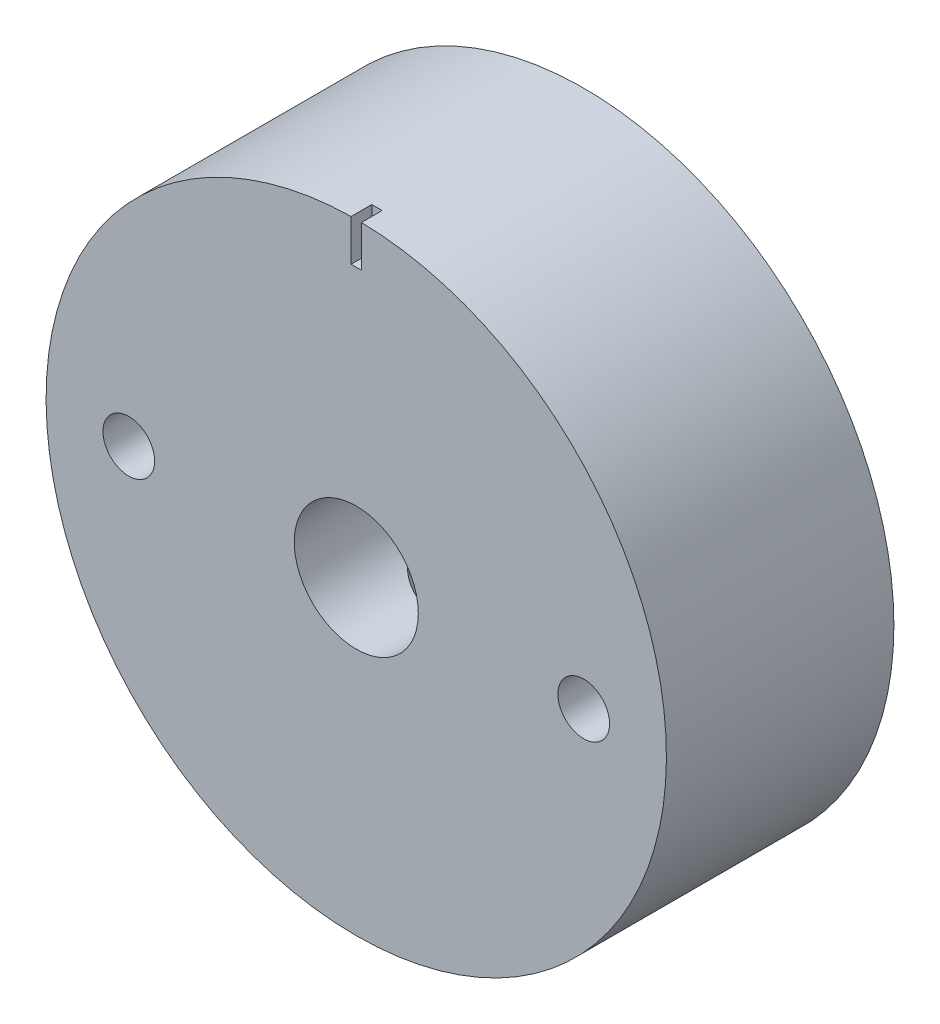
ISO-10303-21;
HEADER;
FILE_DESCRIPTION(('STEP AP214'),'2;1');
FILE_NAME('part.step','',(''),(''),'','','');
FILE_SCHEMA(('AUTOMOTIVE_DESIGN { 1 0 10303 214 1 1 1 1 }'));
ENDSEC;
DATA;
#1=APPLICATION_CONTEXT('core data for automotive mechanical design processes');
#2=APPLICATION_PROTOCOL_DEFINITION('international standard','automotive_design',2000,#1);
#3=PRODUCT_CONTEXT('',#1,'mechanical');
#4=PRODUCT('Part','Part','',(#3));
#5=PRODUCT_RELATED_PRODUCT_CATEGORY('part','',(#4));
#6=PRODUCT_DEFINITION_FORMATION('','',#4);
#7=PRODUCT_DEFINITION_CONTEXT('part definition',#1,'design');
#8=PRODUCT_DEFINITION('design','',#6,#7);
#9=PRODUCT_DEFINITION_SHAPE('','',#8);
#10=(LENGTH_UNIT() NAMED_UNIT(*) SI_UNIT(.MILLI.,.METRE.));
#11=(NAMED_UNIT(*) PLANE_ANGLE_UNIT() SI_UNIT($,.RADIAN.));
#12=(NAMED_UNIT(*) SI_UNIT($,.STERADIAN.) SOLID_ANGLE_UNIT());
#13=UNCERTAINTY_MEASURE_WITH_UNIT(LENGTH_MEASURE(1.E-05),#10,'distance_accuracy_value','');
#14=(GEOMETRIC_REPRESENTATION_CONTEXT(3) GLOBAL_UNCERTAINTY_ASSIGNED_CONTEXT((#13)) GLOBAL_UNIT_ASSIGNED_CONTEXT((#10,
#11,#12)) REPRESENTATION_CONTEXT('',''));
#15=CARTESIAN_POINT('',(0.,0.,0.));
#16=DIRECTION('',(0.,0.,1.));
#17=DIRECTION('',(1.,0.,0.));
#18=AXIS2_PLACEMENT_3D('',#15,#16,#17);
#19=CARTESIAN_POINT('',(0.,0.,11.));
#20=DIRECTION('',(0.,0.,-1.));
#21=DIRECTION('',(-1.,0.,0.));
#22=AXIS2_PLACEMENT_3D('',#19,#20,#21);
#23=CYLINDRICAL_SURFACE('',#22,15.);
#24=CARTESIAN_POINT('',(0.,-15.,7.5));
#25=CARTESIAN_POINT('',(0.139390904958215,-14.9999976116882,7.49999441105218));
#26=CARTESIAN_POINT('',(0.278857881838821,-14.9980367791303,7.48830272503108));
#27=CARTESIAN_POINT('',(0.553880221673043,-14.9904034494139,7.44186434123468));
#28=CARTESIAN_POINT('',(0.689431867959247,-14.9847275392389,7.4070964430884));
#29=CARTESIAN_POINT('',(0.952604747212644,-14.9703006823645,7.31558455140725));
#30=CARTESIAN_POINT('',(1.0802323684319,-14.9615522515919,7.25885853435943));
#31=CARTESIAN_POINT('',(1.32414184197795,-14.9419422708207,7.1250877079476));
#32=CARTESIAN_POINT('',(1.44042498987859,-14.9310809625443,7.048045222517));
#33=CARTESIAN_POINT('',(1.65947261429168,-14.9083331745831,6.87504491617954));
#34=CARTESIAN_POINT('',(1.76211290353497,-14.8964387181486,6.77893088536387));
#35=CARTESIAN_POINT('',(1.94988849865993,-14.8730262687673,6.57085203152719));
#36=CARTESIAN_POINT('',(2.03502269939097,-14.8615082996267,6.45888620854339));
#37=CARTESIAN_POINT('',(2.18586712560513,-14.8400756575978,6.22142903380294));
#38=CARTESIAN_POINT('',(2.251454552861,-14.8301712909164,6.09585866319524));
#39=CARTESIAN_POINT('',(2.36055836541122,-14.8131978979467,5.83529043569937));
#40=CARTESIAN_POINT('',(2.40407624156561,-14.8061286801431,5.70029321632237));
#41=CARTESIAN_POINT('',(2.46741437778481,-14.7957053684276,5.42601972514346));
#42=CARTESIAN_POINT('',(2.4874490291354,-14.792317684857,5.28679426349861));
#43=CARTESIAN_POINT('',(2.50391672528988,-14.7895393893665,5.00691972311653));
#44=CARTESIAN_POINT('',(2.500351440389,-14.7901484945721,4.8662707458327));
#45=CARTESIAN_POINT('',(2.46989509839615,-14.7952642886356,4.58907213872455));
#46=CARTESIAN_POINT('',(2.44324488188977,-14.7997307331892,4.45249519645477));
#47=CARTESIAN_POINT('',(2.36775314040345,-14.8119949521101,4.18577868217087));
#48=CARTESIAN_POINT('',(2.31891085431974,-14.8197928407327,4.05563933111145));
#49=CARTESIAN_POINT('',(2.20017724609391,-14.837884793341,3.80477117655908));
#50=CARTESIAN_POINT('',(2.13018591387971,-14.8481906710733,3.68409059391877));
#51=CARTESIAN_POINT('',(1.97121201755743,-14.8701291841501,3.45609559946161));
#52=CARTESIAN_POINT('',(1.88222792065429,-14.8817619265429,3.34878226754507));
#53=CARTESIAN_POINT('',(1.68648221215905,-14.9052202787979,3.14917391419265));
#54=CARTESIAN_POINT('',(1.57951396387313,-14.9170464923165,3.05708148145992));
#55=CARTESIAN_POINT('',(1.35153524898165,-14.9394260139672,2.89212223733466));
#56=CARTESIAN_POINT('',(1.23052469190642,-14.9499793138975,2.81925554981677));
#57=CARTESIAN_POINT('',(0.977705916166711,-14.9686389289291,2.69479777286372));
#58=CARTESIAN_POINT('',(0.845888725564661,-14.9767431840745,2.64322458066874));
#59=CARTESIAN_POINT('',(0.575298345602731,-14.9895750301266,2.56300578475402));
#60=CARTESIAN_POINT('',(0.436525739179468,-14.9943029035047,2.53435826302628));
#61=CARTESIAN_POINT('',(0.157709901301624,-14.9998112984269,2.50107864153887));
#62=CARTESIAN_POINT('',(0.0177007371510118,-15.0006375301278,2.49616842819439));
#63=CARTESIAN_POINT('',(-0.261139772889887,-14.9983747442117,2.50976134442812));
#64=CARTESIAN_POINT('',(-0.399971163892038,-14.9952858772412,2.52826357313374));
#65=CARTESIAN_POINT('',(-0.671656175546763,-14.985568269382,2.58792484933548));
#66=CARTESIAN_POINT('',(-0.804540868385379,-14.9789610480131,2.62894620839012));
#67=CARTESIAN_POINT('',(-1.06154688486044,-14.9629446445536,2.73233451819953));
#68=CARTESIAN_POINT('',(-1.18566771590972,-14.9535353051202,2.79470266763527));
#69=CARTESIAN_POINT('',(-1.42283068946896,-14.9328451630241,2.93965112469679));
#70=CARTESIAN_POINT('',(-1.53576525093715,-14.9215485588702,3.02240515616725));
#71=CARTESIAN_POINT('',(-1.74624358550269,-14.898384673919,3.20553731538506));
#72=CARTESIAN_POINT('',(-1.84378623969658,-14.8865173517155,3.30591672327667));
#73=CARTESIAN_POINT('',(-2.021742779658,-14.8634017523585,3.52269754807142));
#74=CARTESIAN_POINT('',(-2.10196876111372,-14.8521611613711,3.63925416551441));
#75=CARTESIAN_POINT('',(-2.24170231029499,-14.8317152977788,3.88435296913854));
#76=CARTESIAN_POINT('',(-2.30121053476982,-14.8225099606602,4.01289477522749));
#77=CARTESIAN_POINT('',(-2.39753833147315,-14.807234536977,4.27778973281213));
#78=CARTESIAN_POINT('',(-2.43445143254795,-14.8011515431106,4.41410809503049));
#79=CARTESIAN_POINT('',(-2.48483545377828,-14.7927771683526,4.69112012922176));
#80=CARTESIAN_POINT('',(-2.49830841194617,-14.7904854578272,4.83181341973205));
#81=CARTESIAN_POINT('',(-2.50137286604735,-14.7899673308401,5.11170516596241));
#82=CARTESIAN_POINT('',(-2.49126013612519,-14.7916905650565,5.25090037857529));
#83=CARTESIAN_POINT('',(-2.44807983895685,-14.7988978145373,5.52557924805076));
#84=CARTESIAN_POINT('',(-2.41501234611248,-14.8043818176121,5.66106291694187));
#85=CARTESIAN_POINT('',(-2.3269744895949,-14.8184735628172,5.92435843729261));
#86=CARTESIAN_POINT('',(-2.27202959060044,-14.8270776721967,6.05217901005602));
#87=CARTESIAN_POINT('',(-2.14182700391591,-14.8464436892221,6.29683566919485));
#88=CARTESIAN_POINT('',(-2.06656830874856,-14.857205703884,6.41367121037213));
#89=CARTESIAN_POINT('',(-1.89681888437216,-14.8798345404562,6.63453558310775));
#90=CARTESIAN_POINT('',(-1.80211056359365,-14.891712955763,6.73839601670027));
#91=CARTESIAN_POINT('',(-1.59660903138023,-14.9151437236084,6.92885160447494));
#92=CARTESIAN_POINT('',(-1.48581211291264,-14.9266960002655,7.01544276863817));
#93=CARTESIAN_POINT('',(-1.25036916964028,-14.9482652964222,7.16944826819995));
#94=CARTESIAN_POINT('',(-1.12563278753282,-14.958271162531,7.23672603931295));
#95=CARTESIAN_POINT('',(-0.866513069378982,-14.9755116760178,7.34926948460992));
#96=CARTESIAN_POINT('',(-0.73213949483001,-14.9827490817748,7.3945570810797));
#97=CARTESIAN_POINT('',(-0.497703310045401,-14.9920579083296,7.45200527412667));
#98=CARTESIAN_POINT('',(-0.399058830298447,-14.9950202727336,7.46997446961597));
#99=CARTESIAN_POINT('',(-0.200289310319809,-14.9989921598612,7.49397373784475));
#100=CARTESIAN_POINT('',(-0.100164295608494,-15.0000017162064,7.50000401613736));
#101=CARTESIAN_POINT('',(0.,-15.,7.5));
#102=B_SPLINE_CURVE_WITH_KNOTS('',3,(#24,#25,#26,#27,#28,#29,#30,#31,#32,#33,#34,#35,#36,#37,
#38,#39,#40,#41,#42,#43,#44,#45,#46,#47,#48,#49,#50,#51,#52,#53,#54,#55,#56,#57,#58,#59,#60,#61,
#62,#63,#64,#65,#66,#67,#68,#69,#70,#71,#72,#73,#74,#75,#76,#77,#78,#79,#80,#81,#82,#83,#84,#85,
#86,#87,#88,#89,#90,#91,#92,#93,#94,#95,#96,#97,#98,#99,#100,#101),.UNSPECIFIED.,.T.,.F.,(4,2,2,
2,2,2,2,2,2,2,2,2,2,2,2,2,2,2,2,2,2,2,2,2,2,2,2,2,2,2,2,2,2,2,2,2,2,2,4),(0.,0.41780658493851,
0.835997545695421,1.25384686702527,1.67164841267479,2.09302491062332,2.51442800169857,
2.9384252082384,3.36239376876181,3.78246077103424,4.20249804320886,4.61820521760409,
5.03392665025381,5.45164556632557,5.86939820680574,6.29232769911327,6.71525991635848,
7.13854688915903,7.56179844521149,7.98007883491397,8.3983431303586,8.81407807006416,
9.22983635826067,9.64926825627024,10.0687306305428,10.4925382200762,10.9163323737594,
11.3383602234177,11.7603513778662,12.177079095227,12.5938054618813,13.0100481822622,
13.4263115502934,13.8475138419339,14.2688133387897,14.693022316072,15.1168075213007,
15.4170424816402,15.7172722727697),.UNSPECIFIED.);
#103=CARTESIAN_POINT('',(0.,-15.,7.5));
#104=VERTEX_POINT('',#103);
#105=EDGE_CURVE('E168',#104,#104,#102,.T.);
#106=ORIENTED_EDGE('',*,*,#105,.T.);
#107=EDGE_LOOP('',(#106));
#108=FACE_BOUND('',#107,.T.);
#109=CARTESIAN_POINT('',(0.,0.,0.));
#110=DIRECTION('',(0.,0.,1.));
#111=DIRECTION('',(1.,0.,0.));
#112=AXIS2_PLACEMENT_3D('',#109,#110,#111);
#113=CIRCLE('',#112,15.);
#114=CARTESIAN_POINT('',(15.,0.,0.));
#115=VERTEX_POINT('',#114);
#116=EDGE_CURVE('E180',#115,#115,#113,.T.);
#117=ORIENTED_EDGE('',*,*,#116,.T.);
#118=EDGE_LOOP('',(#117));
#119=FACE_BOUND('',#118,.T.);
#120=CARTESIAN_POINT('',(0.25,14.9979165219706,10.));
#121=DIRECTION('',(-1.,0.,0.));
#122=VECTOR('',#121,1.);
#123=LINE('',#120,#122);
#124=CARTESIAN_POINT('',(0.25,14.9979165219706,10.));
#125=VERTEX_POINT('',#124);
#126=CARTESIAN_POINT('',(-0.25,14.9979165219706,10.));
#127=VERTEX_POINT('',#126);
#128=EDGE_CURVE('E109',#125,#127,#123,.T.);
#129=ORIENTED_EDGE('',*,*,#128,.F.);
#130=DIRECTION('',(0.,0.,1.));
#131=VECTOR('',#130,1.);
#132=CARTESIAN_POINT('',(0.25,14.9979165219706,10.));
#133=LINE('',#132,#131);
#134=CARTESIAN_POINT('',(0.250000000000071,14.9979165219706,11.));
#135=VERTEX_POINT('',#134);
#136=EDGE_CURVE('E104',#125,#135,#133,.T.);
#137=ORIENTED_EDGE('',*,*,#136,.T.);
#138=CARTESIAN_POINT('',(0.,0.,11.));
#139=DIRECTION('',(0.,0.,1.));
#140=DIRECTION('',(1.,0.,0.));
#141=AXIS2_PLACEMENT_3D('',#138,#139,#140);
#142=CIRCLE('',#141,15.);
#143=CARTESIAN_POINT('',(-0.25,14.9979165219706,11.));
#144=VERTEX_POINT('',#143);
#145=EDGE_CURVE('E193',#144,#135,#142,.T.);
#146=ORIENTED_EDGE('',*,*,#145,.F.);
#147=DIRECTION('',(0.,0.,-1.));
#148=VECTOR('',#147,1.);
#149=CARTESIAN_POINT('',(-0.250000000000071,14.9979165219706,11.));
#150=LINE('',#149,#148);
#151=EDGE_CURVE('E11',#127,#144,#150,.F.);
#152=ORIENTED_EDGE('',*,*,#151,.F.);
#153=EDGE_LOOP('',(#129,#137,#146,#152));
#154=FACE_BOUND('',#153,.T.);
#155=ADVANCED_FACE('F44',(#108,#119,#154),#23,.T.);
#156=CARTESIAN_POINT('',(0.,0.,11.));
#157=DIRECTION('',(0.,0.,1.));
#158=DIRECTION('',(1.,0.,0.));
#159=AXIS2_PLACEMENT_3D('',#156,#157,#158);
#160=PLANE('',#159);
#161=CARTESIAN_POINT('',(11.,0.,11.));
#162=DIRECTION('',(0.,0.,1.));
#163=DIRECTION('',(1.,0.,0.));
#164=AXIS2_PLACEMENT_3D('',#161,#162,#163);
#165=CIRCLE('',#164,1.25);
#166=CARTESIAN_POINT('',(12.25,0.,11.));
#167=VERTEX_POINT('',#166);
#168=EDGE_CURVE('E181',#167,#167,#165,.T.);
#169=ORIENTED_EDGE('',*,*,#168,.F.);
#170=EDGE_LOOP('',(#169));
#171=FACE_BOUND('',#170,.T.);
#172=CARTESIAN_POINT('',(-11.,0.,11.));
#173=DIRECTION('',(0.,0.,1.));
#174=DIRECTION('',(1.,0.,0.));
#175=AXIS2_PLACEMENT_3D('',#172,#173,#174);
#176=CIRCLE('',#175,1.25);
#177=CARTESIAN_POINT('',(-9.75,0.,11.));
#178=VERTEX_POINT('',#177);
#179=EDGE_CURVE('E185',#178,#178,#176,.T.);
#180=ORIENTED_EDGE('',*,*,#179,.F.);
#181=EDGE_LOOP('',(#180));
#182=FACE_BOUND('',#181,.T.);
#183=DIRECTION('',(0.,-1.,0.));
#184=VECTOR('',#183,1.);
#185=CARTESIAN_POINT('',(-0.25,14.9979165219706,11.));
#186=LINE('',#185,#184);
#187=CARTESIAN_POINT('',(-0.25,12.9979165219706,11.));
#188=VERTEX_POINT('',#187);
#189=EDGE_CURVE('E60',#144,#188,#186,.T.);
#190=ORIENTED_EDGE('',*,*,#189,.F.);
#191=ORIENTED_EDGE('',*,*,#145,.T.);
#192=DIRECTION('',(0.,1.,0.));
#193=VECTOR('',#192,1.);
#194=CARTESIAN_POINT('',(0.25,14.9979165219706,11.));
#195=LINE('',#194,#193);
#196=CARTESIAN_POINT('',(0.25,12.9979165219706,11.));
#197=VERTEX_POINT('',#196);
#198=EDGE_CURVE('E98',#197,#135,#195,.T.);
#199=ORIENTED_EDGE('',*,*,#198,.F.);
#200=DIRECTION('',(1.,0.,0.));
#201=VECTOR('',#200,1.);
#202=CARTESIAN_POINT('',(-0.25,12.9979165219706,11.));
#203=LINE('',#202,#201);
#204=EDGE_CURVE('E94',#188,#197,#203,.T.);
#205=ORIENTED_EDGE('',*,*,#204,.F.);
#206=EDGE_LOOP('',(#190,#191,#199,#205));
#207=FACE_BOUND('',#206,.T.);
#208=CARTESIAN_POINT('',(0.,0.,11.));
#209=DIRECTION('',(0.,0.,1.));
#210=DIRECTION('',(1.,0.,0.));
#211=AXIS2_PLACEMENT_3D('',#208,#209,#210);
#212=CIRCLE('',#211,3.);
#213=CARTESIAN_POINT('',(3.,0.,11.));
#214=VERTEX_POINT('',#213);
#215=EDGE_CURVE('E115',#214,#214,#212,.T.);
#216=ORIENTED_EDGE('',*,*,#215,.F.);
#217=EDGE_LOOP('',(#216));
#218=FACE_BOUND('',#217,.T.);
#219=ADVANCED_FACE('F149',(#171,#182,#207,#218),#160,.T.);
#220=CARTESIAN_POINT('',(0.,0.,0.));
#221=DIRECTION('',(0.,0.,1.));
#222=DIRECTION('',(1.,0.,0.));
#223=AXIS2_PLACEMENT_3D('',#220,#221,#222);
#224=PLANE('',#223);
#225=CARTESIAN_POINT('',(11.,0.,0.));
#226=DIRECTION('',(0.,0.,1.));
#227=DIRECTION('',(1.,0.,0.));
#228=AXIS2_PLACEMENT_3D('',#225,#226,#227);
#229=CIRCLE('',#228,1.25);
#230=CARTESIAN_POINT('',(12.25,0.,0.));
#231=VERTEX_POINT('',#230);
#232=EDGE_CURVE('E176',#231,#231,#229,.T.);
#233=ORIENTED_EDGE('',*,*,#232,.T.);
#234=EDGE_LOOP('',(#233));
#235=FACE_BOUND('',#234,.T.);
#236=CARTESIAN_POINT('',(-11.,0.,0.));
#237=DIRECTION('',(0.,0.,1.));
#238=DIRECTION('',(1.,0.,0.));
#239=AXIS2_PLACEMENT_3D('',#236,#237,#238);
#240=CIRCLE('',#239,1.25);
#241=CARTESIAN_POINT('',(-9.75,0.,0.));
#242=VERTEX_POINT('',#241);
#243=EDGE_CURVE('E175',#242,#242,#240,.T.);
#244=ORIENTED_EDGE('',*,*,#243,.T.);
#245=EDGE_LOOP('',(#244));
#246=FACE_BOUND('',#245,.T.);
#247=ORIENTED_EDGE('',*,*,#116,.F.);
#248=EDGE_LOOP('',(#247));
#249=FACE_BOUND('',#248,.T.);
#250=CARTESIAN_POINT('',(0.,0.,0.));
#251=DIRECTION('',(0.,0.,1.));
#252=DIRECTION('',(1.,0.,0.));
#253=AXIS2_PLACEMENT_3D('',#250,#251,#252);
#254=CIRCLE('',#253,3.);
#255=CARTESIAN_POINT('',(3.,0.,0.));
#256=VERTEX_POINT('',#255);
#257=EDGE_CURVE('E211',#256,#256,#254,.T.);
#258=ORIENTED_EDGE('',*,*,#257,.T.);
#259=EDGE_LOOP('',(#258));
#260=FACE_BOUND('',#259,.T.);
#261=ADVANCED_FACE('F147',(#235,#246,#249,#260),#224,.F.);
#262=CARTESIAN_POINT('',(0.,0.,11.));
#263=DIRECTION('',(0.,0.,-1.));
#264=DIRECTION('',(-1.,0.,0.));
#265=AXIS2_PLACEMENT_3D('',#262,#263,#264);
#266=CYLINDRICAL_SURFACE('',#265,3.);
#267=CARTESIAN_POINT('',(0.,-3.,7.5));
#268=CARTESIAN_POINT('',(0.118757533193203,-2.99999522795205,7.49999511444632));
#269=CARTESIAN_POINT('',(0.237551281104128,-2.99288670594742,7.49147749609542));
#270=CARTESIAN_POINT('',(0.471182492492811,-2.96510762868268,7.45803727664817));
#271=CARTESIAN_POINT('',(0.586016959612417,-2.94442702942008,7.43310252602469));
#272=CARTESIAN_POINT('',(0.807829942407297,-2.89142690238865,7.36868788266729));
#273=CARTESIAN_POINT('',(0.914850920904902,-2.8591769655007,7.32929492564629));
#274=CARTESIAN_POINT('',(1.11984139043408,-2.78529176182903,7.23798295205742));
#275=CARTESIAN_POINT('',(1.21780780775233,-2.74365332434937,7.18605970332675));
#276=CARTESIAN_POINT('',(1.43789998519767,-2.63674191529867,7.05054625019184));
#277=CARTESIAN_POINT('',(1.5556821965722,-2.56840549256191,6.96232979581782));
#278=CARTESIAN_POINT('',(1.77202398328147,-2.42422624777674,6.76947567424863));
#279=CARTESIAN_POINT('',(1.87052845158605,-2.34836281453276,6.66479243075689));
#280=CARTESIAN_POINT('',(2.00437263805589,-2.23294886313738,6.49591572350891));
#281=CARTESIAN_POINT('',(2.04699726278816,-2.19383679994997,6.4370444238087));
#282=CARTESIAN_POINT('',(2.12715295529554,-2.11620611809193,6.3154943970395));
#283=CARTESIAN_POINT('',(2.16468231743739,-2.07768770195023,6.25281440512926));
#284=CARTESIAN_POINT('',(2.23441122570746,-2.00250543288661,6.12373267566439));
#285=CARTESIAN_POINT('',(2.26662332666227,-1.96583735754651,6.05734021527518));
#286=CARTESIAN_POINT('',(2.32553690612792,-1.89577686630311,5.92055371607161));
#287=CARTESIAN_POINT('',(2.3522430799868,-1.86238167220904,5.85016315265821));
#288=CARTESIAN_POINT('',(2.40193513934005,-1.79791918980412,5.6983329097999));
#289=CARTESIAN_POINT('',(2.42433807692598,-1.76736311251003,5.61647590727652));
#290=CARTESIAN_POINT('',(2.46101313675502,-1.71593180556004,5.4481102311869));
#291=CARTESIAN_POINT('',(2.47530499393792,-1.69503310194197,5.36161341338533));
#292=CARTESIAN_POINT('',(2.49481072799048,-1.66620928968844,5.18423459162055));
#293=CARTESIAN_POINT('',(2.49991205058667,-1.65844510563093,5.09331204092931));
#294=CARTESIAN_POINT('',(2.5000856937119,-1.65818308531825,4.91143738699724));
#295=CARTESIAN_POINT('',(2.49515788278405,-1.6656854491694,4.82048528338467));
#296=CARTESIAN_POINT('',(2.47505262029594,-1.69541639464497,4.63447528917288));
#297=CARTESIAN_POINT('',(2.45905577113332,-1.71881932066467,4.53970625428294));
#298=CARTESIAN_POINT('',(2.41742550503027,-1.77688235738913,4.35578901879783));
#299=CARTESIAN_POINT('',(2.3917601104429,-1.81157977103024,4.26666062928518));
#300=CARTESIAN_POINT('',(2.33816270346873,-1.88002226126137,4.1121729214589));
#301=CARTESIAN_POINT('',(2.31177513033566,-1.91250316845439,4.04568775758835));
#302=CARTESIAN_POINT('',(2.25404424958636,-1.98021996661529,3.91634919322008));
#303=CARTESIAN_POINT('',(2.22269803586306,-2.01545746697785,3.85349795213417));
#304=CARTESIAN_POINT('',(2.12149677560466,-2.12342648109724,3.67003315898033));
#305=CARTESIAN_POINT('',(2.04450664231777,-2.19837696967438,3.55458585239392));
#306=CARTESIAN_POINT('',(1.86765914501414,-2.35079897952277,3.33173303754566));
#307=CARTESIAN_POINT('',(1.76681805277629,-2.42819792618944,3.22506167600812));
#308=CARTESIAN_POINT('',(1.54484388336149,-2.57509054043285,3.0288876551826));
#309=CARTESIAN_POINT('',(1.42375565615774,-2.64460112267364,2.93934796694374));
#310=CARTESIAN_POINT('',(1.19411179169416,-2.75428914126547,2.80058516090145));
#311=CARTESIAN_POINT('',(1.08972732107277,-2.79748350073995,2.74685710181235));
#312=CARTESIAN_POINT('',(0.871071458330371,-2.87307804019801,2.65365725474466));
#313=CARTESIAN_POINT('',(0.756806292780767,-2.90548495660805,2.61417656841943));
#314=CARTESIAN_POINT('',(0.519954301215423,-2.95709834265565,2.5515827500678));
#315=CARTESIAN_POINT('',(0.397310923125312,-2.97620280955844,2.52859605334244));
#316=CARTESIAN_POINT('',(0.14855997692373,-2.99891434528972,2.50129076807281));
#317=CARTESIAN_POINT('',(0.0224547835240053,-3.00253178304177,2.49695968914984));
#318=CARTESIAN_POINT('',(-0.213310199456572,-2.99444999039147,2.50666243944376));
#319=CARTESIAN_POINT('',(-0.323130540835857,-2.98453350716313,2.51855863871517));
#320=CARTESIAN_POINT('',(-0.538644964400602,-2.95325589460136,2.55626695021149));
#321=CARTESIAN_POINT('',(-0.644338549989559,-2.93189339242796,2.58208073171896));
#322=CARTESIAN_POINT('',(-0.850565499199253,-2.87889521546186,2.64662339545526));
#323=CARTESIAN_POINT('',(-0.951010682223312,-2.84712564891974,2.68552078944427));
#324=CARTESIAN_POINT('',(-1.14365900898103,-2.7753612473389,2.7743956323367));
#325=CARTESIAN_POINT('',(-1.2358590883121,-2.73536337221808,2.82437717699329));
#326=CARTESIAN_POINT('',(-1.45067439735099,-2.62975152158594,2.95843179534697));
#327=CARTESIAN_POINT('',(-1.5683435954073,-2.56070244234714,3.0477325832673));
#328=CARTESIAN_POINT('',(-1.78428994740847,-2.41522445403191,3.24284038265563));
#329=CARTESIAN_POINT('',(-1.88250490855173,-2.33877300422835,3.34869845535474));
#330=CARTESIAN_POINT('',(-2.01573314784291,-2.22269805598601,3.51941196792861));
#331=CARTESIAN_POINT('',(-2.05811069143949,-2.1834115173603,3.57889827297598));
#332=CARTESIAN_POINT('',(-2.13771669597406,-2.10553153817181,3.70172081603227));
#333=CARTESIAN_POINT('',(-2.17494330406755,-2.06693835133607,3.76505842766409));
#334=CARTESIAN_POINT('',(-2.24398857026757,-1.9917610848264,3.89548840391518));
#335=CARTESIAN_POINT('',(-2.27582148781537,-1.95517188634212,3.9625702245336));
#336=CARTESIAN_POINT('',(-2.3338885673946,-1.88547561448179,4.10079010449982));
#337=CARTESIAN_POINT('',(-2.36012785984655,-1.85236536450791,4.17192437041937));
#338=CARTESIAN_POINT('',(-2.40837357148322,-1.78925557416047,4.32427036835188));
#339=CARTESIAN_POINT('',(-2.42988314318544,-1.75970711786654,4.40583445107372));
#340=CARTESIAN_POINT('',(-2.46482255689514,-1.71043063887427,4.5734519539426));
#341=CARTESIAN_POINT('',(-2.47827257713357,-1.69067811225259,4.65949357132787));
#342=CARTESIAN_POINT('',(-2.49617289535263,-1.6641531597946,4.83563760741233));
#343=CARTESIAN_POINT('',(-2.5005179918396,-1.65753251048391,4.92577532975068));
#344=CARTESIAN_POINT('',(-2.49938197104456,-1.65924308630667,5.10585321278394));
#345=CARTESIAN_POINT('',(-2.49389826274012,-1.66757825402155,5.19579331512513));
#346=CARTESIAN_POINT('',(-2.47265263848541,-1.69892898735519,5.38167257539052));
#347=CARTESIAN_POINT('',(-2.45585812550761,-1.72341371023858,5.47723027053268));
#348=CARTESIAN_POINT('',(-2.41250339675091,-1.78358728037387,5.6625312960827));
#349=CARTESIAN_POINT('',(-2.38591088285909,-1.81931312531326,5.75225422870929));
#350=CARTESIAN_POINT('',(-2.33050835844919,-1.88952619366194,5.90778904135484));
#351=CARTESIAN_POINT('',(-2.30325853049531,-1.92277816627791,5.97474375923492));
#352=CARTESIAN_POINT('',(-2.24370627018013,-1.9919518523057,6.10494638642439));
#353=CARTESIAN_POINT('',(-2.21140090020864,-2.02787511150519,6.16819211099981));
#354=CARTESIAN_POINT('',(-2.10716294428986,-2.13775931167912,6.35272956134195));
#355=CARTESIAN_POINT('',(-2.02793576743752,-2.2137978016432,6.46874692499193));
#356=CARTESIAN_POINT('',(-1.84629697567414,-2.36772603763546,6.69200726129125));
#357=CARTESIAN_POINT('',(-1.74293959593281,-2.44552394429512,6.79854179403292));
#358=CARTESIAN_POINT('',(-1.51553554935622,-2.59256498427754,6.99386379953934));
#359=CARTESIAN_POINT('',(-1.39153583663216,-2.66182692543067,7.08269056587394));
#360=CARTESIAN_POINT('',(-1.15855518141084,-2.76942305781508,7.21831419672309));
#361=CARTESIAN_POINT('',(-1.05399877947694,-2.81112174006882,7.27003851021944));
#362=CARTESIAN_POINT('',(-0.835439786054369,-2.88361460666452,7.35921867023857));
#363=CARTESIAN_POINT('',(-0.721450026753914,-2.9144233132377,7.39669352409529));
#364=CARTESIAN_POINT('',(-0.506620038886866,-2.9585874590469,7.45018845582659));
#365=CARTESIAN_POINT('',(-0.406845468761931,-2.97402142398111,7.46877512222678));
#366=CARTESIAN_POINT('',(-0.204722725654241,-2.99472922794408,7.49368236823808));
#367=CARTESIAN_POINT('',(-0.102374818922786,-3.00000411373941,7.50000421158692));
#368=CARTESIAN_POINT('',(0.,-3.,7.5));
#369=B_SPLINE_CURVE_WITH_KNOTS('',3,(#267,#268,#269,#270,#271,#272,#273,#274,#275,#276,#277,
#278,#279,#280,#281,#282,#283,#284,#285,#286,#287,#288,#289,#290,#291,#292,#293,#294,#295,#296,
#297,#298,#299,#300,#301,#302,#303,#304,#305,#306,#307,#308,#309,#310,#311,#312,#313,#314,#315,
#316,#317,#318,#319,#320,#321,#322,#323,#324,#325,#326,#327,#328,#329,#330,#331,#332,#333,#334,
#335,#336,#337,#338,#339,#340,#341,#342,#343,#344,#345,#346,#347,#348,#349,#350,#351,#352,#353,
#354,#355,#356,#357,#358,#359,#360,#361,#362,#363,#364,#365,#366,#367,#368),.UNSPECIFIED.,.T.,
.F.,(4,2,2,2,2,2,2,2,2,2,2,2,2,2,2,2,2,2,2,2,2,2,2,2,2,2,2,2,2,2,2,2,2,2,2,2,2,2,2,2,2,2,2,2,2,
2,2,2,2,2,4),(0.,0.355841276815113,0.711946191026961,1.06594405359551,1.42006164830116,
1.90425178760126,2.38980643116775,2.63722280423449,2.88472179650724,3.13162777943676,
3.37832232674674,3.64812890035754,3.91727616616869,4.18969776924975,4.46212294312047,
4.75723524199722,5.05333228584568,5.28870178855694,5.52420974868633,5.9954933935898,
6.49137310548271,6.98616858956867,7.36002155957575,7.73364063000475,8.11009395319721,
8.48629519274361,8.81743460677926,9.14861374669872,9.48423297747606,9.81997643164433,
10.3065635514456,10.7946819775667,11.0432812121088,11.2919696391639,11.5399899810636,
11.787781852862,12.0551105531685,12.3217671309317,12.5914881373799,12.8612802568452,
13.1598101383752,13.4593330283462,13.6977271411687,13.9362602949129,14.4135864576438,
14.914300110886,15.413889999571,15.7841228897598,16.1538601797496,16.4606444271243,
16.7673970625124),.UNSPECIFIED.);
#370=CARTESIAN_POINT('',(0.,-3.,7.5));
#371=VERTEX_POINT('',#370);
#372=EDGE_CURVE('E48',#371,#371,#369,.T.);
#373=ORIENTED_EDGE('',*,*,#372,.F.);
#374=EDGE_LOOP('',(#373));
#375=FACE_BOUND('',#374,.T.);
#376=ORIENTED_EDGE('',*,*,#215,.T.);
#377=EDGE_LOOP('',(#376));
#378=FACE_BOUND('',#377,.T.);
#379=ORIENTED_EDGE('',*,*,#257,.F.);
#380=EDGE_LOOP('',(#379));
#381=FACE_BOUND('',#380,.T.);
#382=ADVANCED_FACE('F136',(#375,#378,#381),#266,.F.);
#383=CARTESIAN_POINT('',(0.,0.,10.));
#384=DIRECTION('',(0.,0.,1.));
#385=DIRECTION('',(1.,0.,0.));
#386=AXIS2_PLACEMENT_3D('',#383,#384,#385);
#387=PLANE('',#386);
#388=DIRECTION('',(0.,-1.,0.));
#389=VECTOR('',#388,1.);
#390=CARTESIAN_POINT('',(-0.25,14.9979165219706,10.));
#391=LINE('',#390,#389);
#392=CARTESIAN_POINT('',(-0.25,12.9979165219706,10.));
#393=VERTEX_POINT('',#392);
#394=EDGE_CURVE('E112',#127,#393,#391,.T.);
#395=ORIENTED_EDGE('',*,*,#394,.T.);
#396=DIRECTION('',(1.,0.,0.));
#397=VECTOR('',#396,1.);
#398=CARTESIAN_POINT('',(-0.25,12.9979165219706,10.));
#399=LINE('',#398,#397);
#400=CARTESIAN_POINT('',(0.25,12.9979165219706,10.));
#401=VERTEX_POINT('',#400);
#402=EDGE_CURVE('E91',#393,#401,#399,.T.);
#403=ORIENTED_EDGE('',*,*,#402,.T.);
#404=DIRECTION('',(0.,1.,0.));
#405=VECTOR('',#404,1.);
#406=CARTESIAN_POINT('',(0.25,14.9979165219706,10.));
#407=LINE('',#406,#405);
#408=EDGE_CURVE('E101',#401,#125,#407,.T.);
#409=ORIENTED_EDGE('',*,*,#408,.T.);
#410=ORIENTED_EDGE('',*,*,#128,.T.);
#411=EDGE_LOOP('',(#395,#403,#409,#410));
#412=FACE_BOUND('',#411,.T.);
#413=ADVANCED_FACE('F111',(#412),#387,.T.);
#414=CARTESIAN_POINT('',(-0.25,12.9979165219706,10.));
#415=DIRECTION('',(0.,-1.,0.));
#416=DIRECTION('',(0.,0.,-1.));
#417=AXIS2_PLACEMENT_3D('',#414,#415,#416);
#418=PLANE('',#417);
#419=ORIENTED_EDGE('',*,*,#204,.T.);
#420=DIRECTION('',(0.,0.,1.));
#421=VECTOR('',#420,1.);
#422=CARTESIAN_POINT('',(0.25,12.9979165219706,10.));
#423=LINE('',#422,#421);
#424=EDGE_CURVE('E87',#401,#197,#423,.T.);
#425=ORIENTED_EDGE('',*,*,#424,.F.);
#426=ORIENTED_EDGE('',*,*,#402,.F.);
#427=DIRECTION('',(0.,0.,1.));
#428=VECTOR('',#427,1.);
#429=CARTESIAN_POINT('',(-0.25,12.9979165219706,10.));
#430=LINE('',#429,#428);
#431=EDGE_CURVE('E119',#393,#188,#430,.T.);
#432=ORIENTED_EDGE('',*,*,#431,.T.);
#433=EDGE_LOOP('',(#419,#425,#426,#432));
#434=FACE_BOUND('',#433,.T.);
#435=ADVANCED_FACE('F89',(#434),#418,.F.);
#436=CARTESIAN_POINT('',(0.25,14.9979165219706,10.));
#437=DIRECTION('',(1.,0.,0.));
#438=DIRECTION('',(0.,1.,0.));
#439=AXIS2_PLACEMENT_3D('',#436,#437,#438);
#440=PLANE('',#439);
#441=ORIENTED_EDGE('',*,*,#198,.T.);
#442=ORIENTED_EDGE('',*,*,#136,.F.);
#443=ORIENTED_EDGE('',*,*,#408,.F.);
#444=ORIENTED_EDGE('',*,*,#424,.T.);
#445=EDGE_LOOP('',(#441,#442,#443,#444));
#446=FACE_BOUND('',#445,.T.);
#447=ADVANCED_FACE('F102',(#446),#440,.F.);
#448=CARTESIAN_POINT('',(-0.25,14.9979165219706,10.));
#449=DIRECTION('',(-1.,0.,0.));
#450=DIRECTION('',(0.,-1.,0.));
#451=AXIS2_PLACEMENT_3D('',#448,#449,#450);
#452=PLANE('',#451);
#453=ORIENTED_EDGE('',*,*,#189,.T.);
#454=ORIENTED_EDGE('',*,*,#431,.F.);
#455=ORIENTED_EDGE('',*,*,#394,.F.);
#456=ORIENTED_EDGE('',*,*,#151,.T.);
#457=EDGE_LOOP('',(#453,#454,#455,#456));
#458=FACE_BOUND('',#457,.T.);
#459=ADVANCED_FACE('F139',(#458),#452,.F.);
#460=CARTESIAN_POINT('',(-11.,0.,0.));
#461=DIRECTION('',(0.,0.,1.));
#462=DIRECTION('',(1.,0.,0.));
#463=AXIS2_PLACEMENT_3D('',#460,#461,#462);
#464=CYLINDRICAL_SURFACE('',#463,1.25);
#465=ORIENTED_EDGE('',*,*,#243,.F.);
#466=EDGE_LOOP('',(#465));
#467=FACE_BOUND('',#466,.T.);
#468=ORIENTED_EDGE('',*,*,#179,.T.);
#469=EDGE_LOOP('',(#468));
#470=FACE_BOUND('',#469,.T.);
#471=ADVANCED_FACE('F143',(#467,#470),#464,.F.);
#472=CARTESIAN_POINT('',(11.,0.,0.));
#473=DIRECTION('',(0.,0.,1.));
#474=DIRECTION('',(1.,0.,0.));
#475=AXIS2_PLACEMENT_3D('',#472,#473,#474);
#476=CYLINDRICAL_SURFACE('',#475,1.25);
#477=ORIENTED_EDGE('',*,*,#232,.F.);
#478=EDGE_LOOP('',(#477));
#479=FACE_BOUND('',#478,.T.);
#480=ORIENTED_EDGE('',*,*,#168,.T.);
#481=EDGE_LOOP('',(#480));
#482=FACE_BOUND('',#481,.T.);
#483=ADVANCED_FACE('F158',(#479,#482),#476,.F.);
#484=CARTESIAN_POINT('',(0.,-16.,5.));
#485=DIRECTION('',(0.,1.,0.));
#486=DIRECTION('',(0.,0.,1.));
#487=AXIS2_PLACEMENT_3D('',#484,#485,#486);
#488=CYLINDRICAL_SURFACE('',#487,2.5);
#489=ORIENTED_EDGE('',*,*,#372,.T.);
#490=EDGE_LOOP('',(#489));
#491=FACE_BOUND('',#490,.T.);
#492=ORIENTED_EDGE('',*,*,#105,.F.);
#493=EDGE_LOOP('',(#492));
#494=FACE_BOUND('',#493,.T.);
#495=ADVANCED_FACE('F161',(#491,#494),#488,.F.);
#496=CLOSED_SHELL('',(#155,#219,#261,#382,#413,#435,#447,#459,#471,#483,#495));
#497=MANIFOLD_SOLID_BREP('B2',#496);
#498=ADVANCED_BREP_SHAPE_REPRESENTATION('',(#18,#497),#14);
#499=SHAPE_DEFINITION_REPRESENTATION(#9,#498);
ENDSEC;
END-ISO-10303-21;
